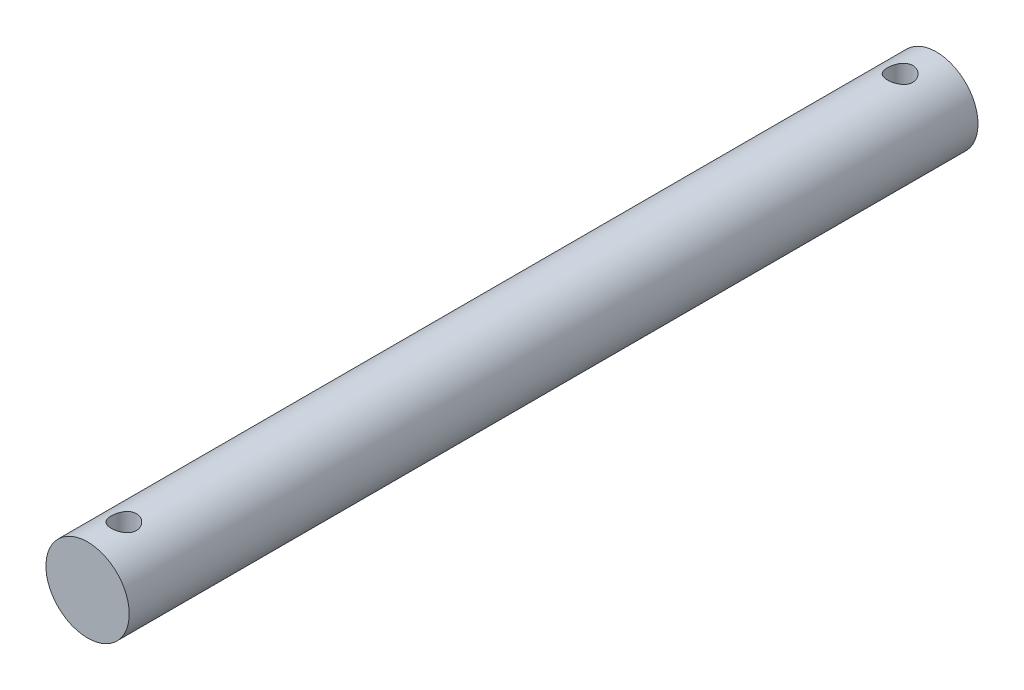
ISO-10303-21;
HEADER;
FILE_DESCRIPTION(('STEP AP214'),'2;1');
FILE_NAME('part.step','',(''),(''),'','','');
FILE_SCHEMA(('AUTOMOTIVE_DESIGN { 1 0 10303 214 1 1 1 1 }'));
ENDSEC;
DATA;
#1=APPLICATION_CONTEXT('core data for automotive mechanical design processes');
#2=APPLICATION_PROTOCOL_DEFINITION('international standard','automotive_design',2000,#1);
#3=PRODUCT_CONTEXT('',#1,'mechanical');
#4=PRODUCT('Part','Part','',(#3));
#5=PRODUCT_RELATED_PRODUCT_CATEGORY('part','',(#4));
#6=PRODUCT_DEFINITION_FORMATION('','',#4);
#7=PRODUCT_DEFINITION_CONTEXT('part definition',#1,'design');
#8=PRODUCT_DEFINITION('design','',#6,#7);
#9=PRODUCT_DEFINITION_SHAPE('','',#8);
#10=(LENGTH_UNIT() NAMED_UNIT(*) SI_UNIT(.MILLI.,.METRE.));
#11=(NAMED_UNIT(*) PLANE_ANGLE_UNIT() SI_UNIT($,.RADIAN.));
#12=(NAMED_UNIT(*) SI_UNIT($,.STERADIAN.) SOLID_ANGLE_UNIT());
#13=UNCERTAINTY_MEASURE_WITH_UNIT(LENGTH_MEASURE(1.E-05),#10,'distance_accuracy_value','');
#14=(GEOMETRIC_REPRESENTATION_CONTEXT(3) GLOBAL_UNCERTAINTY_ASSIGNED_CONTEXT((#13)) GLOBAL_UNIT_ASSIGNED_CONTEXT((#10,
#11,#12)) REPRESENTATION_CONTEXT('',''));
#15=CARTESIAN_POINT('',(0.,0.,0.));
#16=DIRECTION('',(0.,0.,1.));
#17=DIRECTION('',(1.,0.,0.));
#18=AXIS2_PLACEMENT_3D('',#15,#16,#17);
#19=CARTESIAN_POINT('',(0.,0.,117.15));
#20=DIRECTION('',(0.,0.,-1.));
#21=DIRECTION('',(-1.,0.,0.));
#22=AXIS2_PLACEMENT_3D('',#19,#20,#21);
#23=CYLINDRICAL_SURFACE('',#22,5.75);
#24=CARTESIAN_POINT('',(0.,-5.75,113.9));
#25=CARTESIAN_POINT('',(0.0959385713287594,-5.74999928777835,113.899999015544));
#26=CARTESIAN_POINT('',(0.191887129062954,-5.74757604778291,113.892084575488));
#27=CARTESIAN_POINT('',(0.380986060443953,-5.73814623317171,113.860713755079));
#28=CARTESIAN_POINT('',(0.474135661732902,-5.73113840539236,113.837253125266));
#29=CARTESIAN_POINT('',(0.654882106105356,-5.71330648621698,113.77564875893));
#30=CARTESIAN_POINT('',(0.742487052017552,-5.70248812281643,113.737527053072));
#31=CARTESIAN_POINT('',(0.910061375677811,-5.67815701256937,113.647774179451));
#32=CARTESIAN_POINT('',(0.990029669955899,-5.66464388423343,113.596141098603));
#33=CARTESIAN_POINT('',(1.14241673866345,-5.63591702088801,113.47922889998));
#34=CARTESIAN_POINT('',(1.21457883766208,-5.62066767139372,113.41362400026));
#35=CARTESIAN_POINT('',(1.3470652424525,-5.59039738107246,113.27132455424));
#36=CARTESIAN_POINT('',(1.40738748497903,-5.57537648047599,113.19462807911));
#37=CARTESIAN_POINT('',(1.51584662453451,-5.54688517999019,113.030133541635));
#38=CARTESIAN_POINT('',(1.56366770328496,-5.53345893413336,112.942118876368));
#39=CARTESIAN_POINT('',(1.64372440655954,-5.51021055853753,112.758822184792));
#40=CARTESIAN_POINT('',(1.67596389761843,-5.50038753481332,112.663541968214));
#41=CARTESIAN_POINT('',(1.72301200976909,-5.48582941838635,112.471306009556));
#42=CARTESIAN_POINT('',(1.73829484939492,-5.48095624570664,112.374477069449));
#43=CARTESIAN_POINT('',(1.75247689262192,-5.47643909454704,112.179516331369));
#44=CARTESIAN_POINT('',(1.75138019704311,-5.47679380720084,112.081384865646));
#45=CARTESIAN_POINT('',(1.73320623710372,-5.48257014127575,111.890483676235));
#46=CARTESIAN_POINT('',(1.7167260602907,-5.48780243631886,111.797650426375));
#47=CARTESIAN_POINT('',(1.66921881423739,-5.50243765779226,111.616134415106));
#48=CARTESIAN_POINT('',(1.63819027151027,-5.51184100666981,111.527452075109));
#49=CARTESIAN_POINT('',(1.56203354523887,-5.53390783991856,111.3553078955));
#50=CARTESIAN_POINT('',(1.51671383693437,-5.54661517100887,111.271936647735));
#51=CARTESIAN_POINT('',(1.41339431878934,-5.57383743640775,111.11378380161));
#52=CARTESIAN_POINT('',(1.35539135927417,-5.58835281932993,111.039004343927));
#53=CARTESIAN_POINT('',(1.22539861007512,-5.61832064885968,110.89677497668));
#54=CARTESIAN_POINT('',(1.15291420100984,-5.63378653524159,110.829779167661));
#55=CARTESIAN_POINT('',(0.997546563326113,-5.66335994077207,110.708786693874));
#56=CARTESIAN_POINT('',(0.914662642057689,-5.67746736933109,110.65479089566));
#57=CARTESIAN_POINT('',(0.740006340300693,-5.70286965528536,110.561044550897));
#58=CARTESIAN_POINT('',(0.64817529977868,-5.7141439376432,110.521397342513));
#59=CARTESIAN_POINT('',(0.458725349157116,-5.7324612780653,110.458245604803));
#60=CARTESIAN_POINT('',(0.361108111222858,-5.73950555208144,110.434736436183));
#61=CARTESIAN_POINT('',(0.166715146681215,-5.74837570451892,110.405290141466));
#62=CARTESIAN_POINT('',(0.070040803003699,-5.75038419385996,110.398737818359));
#63=CARTESIAN_POINT('',(-0.123033725381385,-5.74949370771951,110.401663383074));
#64=CARTESIAN_POINT('',(-0.219433946031256,-5.74659540842732,110.411139062127));
#65=CARTESIAN_POINT('',(-0.406884309721018,-5.73633670363618,110.445355411109));
#66=CARTESIAN_POINT('',(-0.49800682478584,-5.72908210804504,110.469734342159));
#67=CARTESIAN_POINT('',(-0.674846412315206,-5.71095352507735,110.532627823723));
#68=CARTESIAN_POINT('',(-0.760562826945011,-5.70007909823292,110.571144090647));
#69=CARTESIAN_POINT('',(-0.926402815937071,-5.67551543698637,110.662236951982));
#70=CARTESIAN_POINT('',(-1.00634690585545,-5.66176588879431,110.715123604028));
#71=CARTESIAN_POINT('',(-1.15643402748901,-5.6330284271798,110.833080866377));
#72=CARTESIAN_POINT('',(-1.22657452438565,-5.61804019507124,110.898154617639));
#73=CARTESIAN_POINT('',(-1.35778736868868,-5.58781007369419,111.041530535008));
#74=CARTESIAN_POINT('',(-1.41842172800338,-5.57257970682757,111.120236847127));
#75=CARTESIAN_POINT('',(-1.52565587348097,-5.54418273004371,111.287038377179));
#76=CARTESIAN_POINT('',(-1.57225598171088,-5.53101607277048,111.37513337959));
#77=CARTESIAN_POINT('',(-1.64978909325865,-5.50838723871704,111.557962906399));
#78=CARTESIAN_POINT('',(-1.68079118431685,-5.49890876907322,111.652665998298));
#79=CARTESIAN_POINT('',(-1.72630914605966,-5.48479130561698,111.846292589456));
#80=CARTESIAN_POINT('',(-1.74083087782624,-5.48015059135103,111.945214575311));
#81=CARTESIAN_POINT('',(-1.75256961712525,-5.47640695713794,112.139911124122));
#82=CARTESIAN_POINT('',(-1.75050214376061,-5.47707504747841,112.235638696941));
#83=CARTESIAN_POINT('',(-1.73083575800854,-5.48332122336449,112.425313396512));
#84=CARTESIAN_POINT('',(-1.71323750191932,-5.48889910143278,112.519260598326));
#85=CARTESIAN_POINT('',(-1.66347696659913,-5.5041805294775,112.701500418495));
#86=CARTESIAN_POINT('',(-1.6315093919208,-5.51382882124011,112.789851179647));
#87=CARTESIAN_POINT('',(-1.55406978053486,-5.53615241583177,112.96000582629));
#88=CARTESIAN_POINT('',(-1.50859510171481,-5.54882831079243,113.041808426924));
#89=CARTESIAN_POINT('',(-1.40344342971552,-5.57636988722287,113.199851608945));
#90=CARTESIAN_POINT('',(-1.34329929003115,-5.59129968881273,113.275770193865));
#91=CARTESIAN_POINT('',(-1.21135031194525,-5.6213612535034,113.416669024319));
#92=CARTESIAN_POINT('',(-1.13954241675892,-5.63649306859028,113.481646393311));
#93=CARTESIAN_POINT('',(-0.983676589876039,-5.6658051979512,113.600789502351));
#94=CARTESIAN_POINT('',(-0.899312674628893,-5.67994261557294,113.654566623443));
#95=CARTESIAN_POINT('',(-0.7223108279757,-5.70515014811673,113.747100222591));
#96=CARTESIAN_POINT('',(-0.629676579305499,-5.71622161936861,113.785863345656));
#97=CARTESIAN_POINT('',(-0.44827585420314,-5.73314989234598,113.844019076472));
#98=CARTESIAN_POINT('',(-0.360039802026547,-5.73941556358756,113.86495381595));
#99=CARTESIAN_POINT('',(-0.181205185597138,-5.74784058684039,113.89294350244));
#100=CARTESIAN_POINT('',(-0.0906070464543938,-5.75000067264187,113.900000929748));
#101=CARTESIAN_POINT('',(0.,-5.75,113.9));
#102=B_SPLINE_CURVE_WITH_KNOTS('',3,(#24,#25,#26,#27,#28,#29,#30,#31,#32,#33,#34,#35,#36,#37,
#38,#39,#40,#41,#42,#43,#44,#45,#46,#47,#48,#49,#50,#51,#52,#53,#54,#55,#56,#57,#58,#59,#60,#61,
#62,#63,#64,#65,#66,#67,#68,#69,#70,#71,#72,#73,#74,#75,#76,#77,#78,#79,#80,#81,#82,#83,#84,#85,
#86,#87,#88,#89,#90,#91,#92,#93,#94,#95,#96,#97,#98,#99,#100,#101),.UNSPECIFIED.,.T.,.F.,(4,2,2,
2,2,2,2,2,2,2,2,2,2,2,2,2,2,2,2,2,2,2,2,2,2,2,2,2,2,2,2,2,2,2,2,2,2,2,4),(0.,0.287482817599106,
0.575044249378853,0.862175250836252,1.14934692942179,1.44413974938822,1.73898389572087,
2.04068122222846,2.34230364475788,2.63525967032535,2.92814235194373,3.21010987256567,
3.49210595757811,3.77805449327284,4.06407412034252,4.3624063635186,4.66075848739856,
4.96121847505486,5.26159205153441,5.55090461998096,5.84017732240673,6.12269302127628,
6.40524303166018,6.69445397412987,6.98373955723926,7.28385916157827,7.58397187805472,
7.88274334860935,8.18140853062111,8.4672633499371,8.75310609020819,9.03518724951489,
9.31732362284115,9.61000113895155,9.90275548280157,10.2044074952203,10.5059258472411,
10.7774811295992,11.0489878723855),.UNSPECIFIED.);
#103=CARTESIAN_POINT('',(0.,-5.75,113.9));
#104=VERTEX_POINT('',#103);
#105=EDGE_CURVE('E41',#104,#104,#102,.T.);
#106=ORIENTED_EDGE('',*,*,#105,.T.);
#107=EDGE_LOOP('',(#106));
#108=FACE_BOUND('',#107,.T.);
#109=CARTESIAN_POINT('',(0.,5.75,113.9));
#110=CARTESIAN_POINT('',(-0.0959385713287594,5.74999928777835,113.899999015544));
#111=CARTESIAN_POINT('',(-0.191887129062954,5.74757604778291,113.892084575488));
#112=CARTESIAN_POINT('',(-0.380986060443953,5.73814623317171,113.860713755079));
#113=CARTESIAN_POINT('',(-0.474135661732902,5.73113840539236,113.837253125266));
#114=CARTESIAN_POINT('',(-0.654882106105356,5.71330648621698,113.77564875893));
#115=CARTESIAN_POINT('',(-0.742487052017552,5.70248812281643,113.737527053072));
#116=CARTESIAN_POINT('',(-0.910061375677811,5.67815701256937,113.647774179451));
#117=CARTESIAN_POINT('',(-0.990029669955899,5.66464388423343,113.596141098603));
#118=CARTESIAN_POINT('',(-1.14241673866345,5.63591702088801,113.47922889998));
#119=CARTESIAN_POINT('',(-1.21457883766208,5.62066767139372,113.41362400026));
#120=CARTESIAN_POINT('',(-1.3470652424525,5.59039738107246,113.27132455424));
#121=CARTESIAN_POINT('',(-1.40738748497903,5.57537648047599,113.19462807911));
#122=CARTESIAN_POINT('',(-1.51584662453451,5.54688517999019,113.030133541635));
#123=CARTESIAN_POINT('',(-1.56366770328496,5.53345893413336,112.942118876368));
#124=CARTESIAN_POINT('',(-1.64372440655954,5.51021055853753,112.758822184792));
#125=CARTESIAN_POINT('',(-1.67596389761843,5.50038753481332,112.663541968214));
#126=CARTESIAN_POINT('',(-1.72301200976909,5.48582941838635,112.471306009556));
#127=CARTESIAN_POINT('',(-1.73829484939492,5.48095624570664,112.374477069449));
#128=CARTESIAN_POINT('',(-1.75247689262192,5.47643909454704,112.179516331369));
#129=CARTESIAN_POINT('',(-1.75138019704311,5.47679380720084,112.081384865646));
#130=CARTESIAN_POINT('',(-1.73320623710372,5.48257014127575,111.890483676235));
#131=CARTESIAN_POINT('',(-1.7167260602907,5.48780243631886,111.797650426375));
#132=CARTESIAN_POINT('',(-1.66921881423739,5.50243765779226,111.616134415106));
#133=CARTESIAN_POINT('',(-1.63819027151027,5.51184100666981,111.527452075109));
#134=CARTESIAN_POINT('',(-1.56203354523887,5.53390783991856,111.3553078955));
#135=CARTESIAN_POINT('',(-1.51671383693437,5.54661517100887,111.271936647735));
#136=CARTESIAN_POINT('',(-1.41339431878934,5.57383743640775,111.11378380161));
#137=CARTESIAN_POINT('',(-1.35539135927417,5.58835281932993,111.039004343927));
#138=CARTESIAN_POINT('',(-1.22539861007512,5.61832064885968,110.89677497668));
#139=CARTESIAN_POINT('',(-1.15291420100984,5.63378653524159,110.829779167661));
#140=CARTESIAN_POINT('',(-0.997546563326113,5.66335994077207,110.708786693874));
#141=CARTESIAN_POINT('',(-0.914662642057689,5.67746736933109,110.65479089566));
#142=CARTESIAN_POINT('',(-0.740006340300693,5.70286965528536,110.561044550897));
#143=CARTESIAN_POINT('',(-0.64817529977868,5.7141439376432,110.521397342513));
#144=CARTESIAN_POINT('',(-0.458725349157116,5.7324612780653,110.458245604803));
#145=CARTESIAN_POINT('',(-0.361108111222858,5.73950555208144,110.434736436183));
#146=CARTESIAN_POINT('',(-0.166715146681215,5.74837570451892,110.405290141466));
#147=CARTESIAN_POINT('',(-0.070040803003699,5.75038419385996,110.398737818359));
#148=CARTESIAN_POINT('',(0.123033725381385,5.74949370771951,110.401663383074));
#149=CARTESIAN_POINT('',(0.219433946031256,5.74659540842732,110.411139062127));
#150=CARTESIAN_POINT('',(0.406884309721018,5.73633670363618,110.445355411109));
#151=CARTESIAN_POINT('',(0.49800682478584,5.72908210804504,110.469734342159));
#152=CARTESIAN_POINT('',(0.674846412315206,5.71095352507735,110.532627823723));
#153=CARTESIAN_POINT('',(0.760562826945011,5.70007909823292,110.571144090647));
#154=CARTESIAN_POINT('',(0.926402815937071,5.67551543698637,110.662236951982));
#155=CARTESIAN_POINT('',(1.00634690585545,5.66176588879431,110.715123604028));
#156=CARTESIAN_POINT('',(1.15643402748901,5.6330284271798,110.833080866377));
#157=CARTESIAN_POINT('',(1.22657452438565,5.61804019507124,110.898154617639));
#158=CARTESIAN_POINT('',(1.35778736868868,5.58781007369419,111.041530535008));
#159=CARTESIAN_POINT('',(1.41842172800338,5.57257970682757,111.120236847127));
#160=CARTESIAN_POINT('',(1.52565587348097,5.54418273004371,111.287038377179));
#161=CARTESIAN_POINT('',(1.57225598171088,5.53101607277048,111.37513337959));
#162=CARTESIAN_POINT('',(1.64978909325865,5.50838723871704,111.557962906399));
#163=CARTESIAN_POINT('',(1.68079118431685,5.49890876907322,111.652665998298));
#164=CARTESIAN_POINT('',(1.72630914605966,5.48479130561698,111.846292589456));
#165=CARTESIAN_POINT('',(1.74083087782624,5.48015059135103,111.945214575311));
#166=CARTESIAN_POINT('',(1.75256961712525,5.47640695713794,112.139911124122));
#167=CARTESIAN_POINT('',(1.75050214376061,5.47707504747841,112.235638696941));
#168=CARTESIAN_POINT('',(1.73083575800854,5.48332122336449,112.425313396512));
#169=CARTESIAN_POINT('',(1.71323750191932,5.48889910143278,112.519260598326));
#170=CARTESIAN_POINT('',(1.66347696659913,5.5041805294775,112.701500418495));
#171=CARTESIAN_POINT('',(1.6315093919208,5.51382882124011,112.789851179647));
#172=CARTESIAN_POINT('',(1.55406978053486,5.53615241583177,112.96000582629));
#173=CARTESIAN_POINT('',(1.50859510171481,5.54882831079243,113.041808426924));
#174=CARTESIAN_POINT('',(1.40344342971552,5.57636988722287,113.199851608945));
#175=CARTESIAN_POINT('',(1.34329929003115,5.59129968881273,113.275770193865));
#176=CARTESIAN_POINT('',(1.21135031194525,5.6213612535034,113.416669024319));
#177=CARTESIAN_POINT('',(1.13954241675892,5.63649306859028,113.481646393311));
#178=CARTESIAN_POINT('',(0.983676589876039,5.6658051979512,113.600789502351));
#179=CARTESIAN_POINT('',(0.899312674628893,5.67994261557294,113.654566623443));
#180=CARTESIAN_POINT('',(0.7223108279757,5.70515014811673,113.747100222591));
#181=CARTESIAN_POINT('',(0.629676579305499,5.71622161936861,113.785863345656));
#182=CARTESIAN_POINT('',(0.44827585420314,5.73314989234598,113.844019076472));
#183=CARTESIAN_POINT('',(0.360039802026547,5.73941556358756,113.86495381595));
#184=CARTESIAN_POINT('',(0.181205185597138,5.74784058684039,113.89294350244));
#185=CARTESIAN_POINT('',(0.0906070464543938,5.75000067264187,113.900000929748));
#186=CARTESIAN_POINT('',(0.,5.75,113.9));
#187=B_SPLINE_CURVE_WITH_KNOTS('',3,(#109,#110,#111,#112,#113,#114,#115,#116,#117,#118,#119,
#120,#121,#122,#123,#124,#125,#126,#127,#128,#129,#130,#131,#132,#133,#134,#135,#136,#137,#138,
#139,#140,#141,#142,#143,#144,#145,#146,#147,#148,#149,#150,#151,#152,#153,#154,#155,#156,#157,
#158,#159,#160,#161,#162,#163,#164,#165,#166,#167,#168,#169,#170,#171,#172,#173,#174,#175,#176,
#177,#178,#179,#180,#181,#182,#183,#184,#185,#186),.UNSPECIFIED.,.T.,.F.,(4,2,2,2,2,2,2,2,2,2,2,
2,2,2,2,2,2,2,2,2,2,2,2,2,2,2,2,2,2,2,2,2,2,2,2,2,2,2,4),(0.,0.287482817599106,
0.575044249378853,0.862175250836252,1.14934692942179,1.44413974938822,1.73898389572087,
2.04068122222846,2.34230364475788,2.63525967032535,2.92814235194373,3.21010987256567,
3.49210595757811,3.77805449327284,4.06407412034252,4.3624063635186,4.66075848739856,
4.96121847505486,5.26159205153441,5.55090461998096,5.84017732240673,6.12269302127628,
6.40524303166018,6.69445397412987,6.98373955723926,7.28385916157827,7.58397187805472,
7.88274334860935,8.18140853062111,8.4672633499371,8.75310609020819,9.03518724951489,
9.31732362284115,9.61000113895155,9.90275548280157,10.2044074952203,10.5059258472411,
10.7774811295992,11.0489878723855),.UNSPECIFIED.);
#188=CARTESIAN_POINT('',(0.,5.75,113.9));
#189=VERTEX_POINT('',#188);
#190=EDGE_CURVE('E96',#189,#189,#187,.T.);
#191=ORIENTED_EDGE('',*,*,#190,.T.);
#192=EDGE_LOOP('',(#191));
#193=FACE_BOUND('',#192,.T.);
#194=CARTESIAN_POINT('',(0.,0.,117.15));
#195=DIRECTION('',(0.,0.,1.));
#196=DIRECTION('',(1.,0.,0.));
#197=AXIS2_PLACEMENT_3D('',#194,#195,#196);
#198=CIRCLE('',#197,5.75);
#199=CARTESIAN_POINT('',(5.75,0.,117.15));
#200=VERTEX_POINT('',#199);
#201=EDGE_CURVE('E10',#200,#200,#198,.T.);
#202=ORIENTED_EDGE('',*,*,#201,.F.);
#203=EDGE_LOOP('',(#202));
#204=FACE_BOUND('',#203,.T.);
#205=CARTESIAN_POINT('',(0.,0.,0.));
#206=DIRECTION('',(0.,0.,1.));
#207=DIRECTION('',(1.,0.,0.));
#208=AXIS2_PLACEMENT_3D('',#205,#206,#207);
#209=CIRCLE('',#208,5.75);
#210=CARTESIAN_POINT('',(5.75,0.,0.));
#211=VERTEX_POINT('',#210);
#212=EDGE_CURVE('E50',#211,#211,#209,.T.);
#213=ORIENTED_EDGE('',*,*,#212,.T.);
#214=EDGE_LOOP('',(#213));
#215=FACE_BOUND('',#214,.T.);
#216=CARTESIAN_POINT('',(0.,-5.75,3.25));
#217=CARTESIAN_POINT('',(0.0959385713287591,-5.74999928777835,3.25000098445609));
#218=CARTESIAN_POINT('',(0.191887129062953,-5.74757604778291,3.25791542451199));
#219=CARTESIAN_POINT('',(0.380986060443951,-5.73814623317171,3.28928624492064));
#220=CARTESIAN_POINT('',(0.4741356617329,-5.73113840539236,3.3127468747335));
#221=CARTESIAN_POINT('',(0.654882106105352,-5.71330648621698,3.37435124106983));
#222=CARTESIAN_POINT('',(0.742487052017546,-5.70248812281644,3.41247294692825));
#223=CARTESIAN_POINT('',(0.910061375677803,-5.67815701256937,3.50222582054881));
#224=CARTESIAN_POINT('',(0.99002966995589,-5.66464388423343,3.55385890139742));
#225=CARTESIAN_POINT('',(1.14241673866344,-5.63591702088801,3.67077110002036));
#226=CARTESIAN_POINT('',(1.21457883766207,-5.62066767139372,3.7363759997399));
#227=CARTESIAN_POINT('',(1.34706524245249,-5.59039738107246,3.8786754457603));
#228=CARTESIAN_POINT('',(1.40738748497902,-5.57537648047599,3.95537192089033));
#229=CARTESIAN_POINT('',(1.5158466245345,-5.54688517999019,4.11986645836505));
#230=CARTESIAN_POINT('',(1.56366770328496,-5.53345893413336,4.20788112363194));
#231=CARTESIAN_POINT('',(1.64372440655953,-5.51021055853754,4.39117781520815));
#232=CARTESIAN_POINT('',(1.67596389761842,-5.50038753481332,4.48645803178633));
#233=CARTESIAN_POINT('',(1.72301200976908,-5.48582941838635,4.67869399044358));
#234=CARTESIAN_POINT('',(1.73829484939491,-5.48095624570665,4.77552293055072));
#235=CARTESIAN_POINT('',(1.75247689262191,-5.47643909454705,4.97048366863124));
#236=CARTESIAN_POINT('',(1.7513801970431,-5.47679380720085,5.06861513435426));
#237=CARTESIAN_POINT('',(1.73320623710371,-5.48257014127575,5.25951632376466));
#238=CARTESIAN_POINT('',(1.71672606029069,-5.48780243631886,5.35234957362478));
#239=CARTESIAN_POINT('',(1.66921881423738,-5.50243765779226,5.53386558489435));
#240=CARTESIAN_POINT('',(1.63819027151026,-5.51184100666981,5.62254792489071));
#241=CARTESIAN_POINT('',(1.56203354523885,-5.53390783991856,5.79469210450024));
#242=CARTESIAN_POINT('',(1.51671383693436,-5.54661517100887,5.87806335226514));
#243=CARTESIAN_POINT('',(1.41339431878933,-5.57383743640775,6.0362161983899));
#244=CARTESIAN_POINT('',(1.35539135927416,-5.58835281932994,6.1109956560725));
#245=CARTESIAN_POINT('',(1.22539861007511,-5.61832064885968,6.25322502332016));
#246=CARTESIAN_POINT('',(1.15291420100984,-5.63378653524159,6.32022083233922));
#247=CARTESIAN_POINT('',(0.997546563326113,-5.66335994077207,6.4412133061259));
#248=CARTESIAN_POINT('',(0.914662642057686,-5.67746736933109,6.49520910433986));
#249=CARTESIAN_POINT('',(0.740006340300687,-5.70286965528536,6.58895544910279));
#250=CARTESIAN_POINT('',(0.648175299778673,-5.7141439376432,6.62860265748745));
#251=CARTESIAN_POINT('',(0.458725349157109,-5.7324612780653,6.69175439519696));
#252=CARTESIAN_POINT('',(0.361108111222851,-5.73950555208144,6.71526356381708));
#253=CARTESIAN_POINT('',(0.166715146681207,-5.74837570451892,6.74470985853363));
#254=CARTESIAN_POINT('',(0.070040803003693,-5.75038419385996,6.75126218164074));
#255=CARTESIAN_POINT('',(-0.12303372538139,-5.74949370771951,6.74833661692566));
#256=CARTESIAN_POINT('',(-0.21943394603126,-5.74659540842732,6.73886093787281));
#257=CARTESIAN_POINT('',(-0.406884309721018,-5.73633670363618,6.70464458889131));
#258=CARTESIAN_POINT('',(-0.498006824785836,-5.72908210804503,6.68026565784105));
#259=CARTESIAN_POINT('',(-0.6748464123152,-5.71095352507735,6.61737217627732));
#260=CARTESIAN_POINT('',(-0.760562826945007,-5.70007909823292,6.57885590935332));
#261=CARTESIAN_POINT('',(-0.926402815937066,-5.67551543698637,6.48776304801783));
#262=CARTESIAN_POINT('',(-1.00634690585544,-5.66176588879431,6.43487639597208));
#263=CARTESIAN_POINT('',(-1.156434027489,-5.6330284271798,6.31691913362321));
#264=CARTESIAN_POINT('',(-1.22657452438564,-5.61804019507124,6.25184538236129));
#265=CARTESIAN_POINT('',(-1.35778736868868,-5.58781007369419,6.10846946499204));
#266=CARTESIAN_POINT('',(-1.41842172800337,-5.57257970682757,6.02976315287282));
#267=CARTESIAN_POINT('',(-1.52565587348096,-5.54418273004371,5.86296162282136));
#268=CARTESIAN_POINT('',(-1.57225598171087,-5.53101607277048,5.77486662040964));
#269=CARTESIAN_POINT('',(-1.64978909325864,-5.50838723871704,5.59203709360121));
#270=CARTESIAN_POINT('',(-1.68079118431684,-5.49890876907322,5.49733400170234));
#271=CARTESIAN_POINT('',(-1.72630914605965,-5.48479130561698,5.30370741054431));
#272=CARTESIAN_POINT('',(-1.74083087782623,-5.48015059135103,5.20478542468901));
#273=CARTESIAN_POINT('',(-1.75256961712523,-5.47640695713795,5.0100888758783));
#274=CARTESIAN_POINT('',(-1.7505021437606,-5.47707504747841,4.91436130305891));
#275=CARTESIAN_POINT('',(-1.73083575800853,-5.4833212233645,4.72468660348847));
#276=CARTESIAN_POINT('',(-1.71323750191931,-5.48889910143278,4.63073940167405));
#277=CARTESIAN_POINT('',(-1.66347696659913,-5.5041805294775,4.44849958150498));
#278=CARTESIAN_POINT('',(-1.6315093919208,-5.51382882124011,4.36014882035343));
#279=CARTESIAN_POINT('',(-1.55406978053486,-5.53615241583177,4.18999417370982));
#280=CARTESIAN_POINT('',(-1.5085951017148,-5.54882831079243,4.10819157307554));
#281=CARTESIAN_POINT('',(-1.40344342971551,-5.57636988722287,3.95014839105541));
#282=CARTESIAN_POINT('',(-1.34329929003114,-5.59129968881273,3.87422980613475));
#283=CARTESIAN_POINT('',(-1.21135031194524,-5.6213612535034,3.73333097568074));
#284=CARTESIAN_POINT('',(-1.13954241675891,-5.63649306859029,3.66835360668869));
#285=CARTESIAN_POINT('',(-0.983676589876031,-5.6658051979512,3.54921049764876));
#286=CARTESIAN_POINT('',(-0.899312674628887,-5.67994261557294,3.49543337655733));
#287=CARTESIAN_POINT('',(-0.722310827975696,-5.70515014811673,3.40289977740904));
#288=CARTESIAN_POINT('',(-0.629676579305494,-5.71622161936861,3.36413665434357));
#289=CARTESIAN_POINT('',(-0.448275854203135,-5.73314989234598,3.30598092352814));
#290=CARTESIAN_POINT('',(-0.360039802026543,-5.73941556358756,3.28504618404956));
#291=CARTESIAN_POINT('',(-0.181205185597135,-5.74784058684039,3.2570564975598));
#292=CARTESIAN_POINT('',(-0.0906070464543924,-5.75000067264187,3.24999907025237));
#293=CARTESIAN_POINT('',(0.,-5.75,3.25));
#294=B_SPLINE_CURVE_WITH_KNOTS('',3,(#216,#217,#218,#219,#220,#221,#222,#223,#224,#225,#226,
#227,#228,#229,#230,#231,#232,#233,#234,#235,#236,#237,#238,#239,#240,#241,#242,#243,#244,#245,
#246,#247,#248,#249,#250,#251,#252,#253,#254,#255,#256,#257,#258,#259,#260,#261,#262,#263,#264,
#265,#266,#267,#268,#269,#270,#271,#272,#273,#274,#275,#276,#277,#278,#279,#280,#281,#282,#283,
#284,#285,#286,#287,#288,#289,#290,#291,#292,#293),.UNSPECIFIED.,.T.,.F.,(4,2,2,2,2,2,2,2,2,2,2,
2,2,2,2,2,2,2,2,2,2,2,2,2,2,2,2,2,2,2,2,2,2,2,2,2,2,2,4),(0.,0.287482817599105,0.57504424937885,
0.862175250836247,1.14934692942177,1.4441397493882,1.73898389572086,2.04068122222845,
2.34230364475786,2.63525967032531,2.92814235194371,3.21010987256565,3.49210595757809,
3.77805449327281,4.06407412034249,4.36240636351856,4.66075848739852,4.96121847505483,
5.26159205153438,5.55090461998093,5.8401773224067,6.12269302127624,6.40524303166014,
6.69445397412982,6.98373955723922,7.28385916157821,7.58397187805467,7.8827433486093,
8.18140853062105,8.46726334993702,8.75310609020813,9.03518724951482,9.31732362284109,
9.61000113895148,9.9027554828015,10.2044074952202,10.505925847241,10.7774811295992,
11.0489878723855),.UNSPECIFIED.);
#295=CARTESIAN_POINT('',(0.,-5.75,3.25));
#296=VERTEX_POINT('',#295);
#297=EDGE_CURVE('E59',#296,#296,#294,.T.);
#298=ORIENTED_EDGE('',*,*,#297,.F.);
#299=EDGE_LOOP('',(#298));
#300=FACE_BOUND('',#299,.T.);
#301=CARTESIAN_POINT('',(0.,5.75,3.25));
#302=CARTESIAN_POINT('',(-0.0959385713287591,5.74999928777835,3.25000098445609));
#303=CARTESIAN_POINT('',(-0.191887129062953,5.74757604778291,3.25791542451199));
#304=CARTESIAN_POINT('',(-0.380986060443951,5.73814623317171,3.28928624492064));
#305=CARTESIAN_POINT('',(-0.4741356617329,5.73113840539236,3.3127468747335));
#306=CARTESIAN_POINT('',(-0.654882106105352,5.71330648621698,3.37435124106983));
#307=CARTESIAN_POINT('',(-0.742487052017546,5.70248812281644,3.41247294692825));
#308=CARTESIAN_POINT('',(-0.910061375677803,5.67815701256937,3.50222582054881));
#309=CARTESIAN_POINT('',(-0.99002966995589,5.66464388423343,3.55385890139742));
#310=CARTESIAN_POINT('',(-1.14241673866344,5.63591702088801,3.67077110002036));
#311=CARTESIAN_POINT('',(-1.21457883766207,5.62066767139372,3.7363759997399));
#312=CARTESIAN_POINT('',(-1.34706524245249,5.59039738107246,3.8786754457603));
#313=CARTESIAN_POINT('',(-1.40738748497902,5.57537648047599,3.95537192089033));
#314=CARTESIAN_POINT('',(-1.5158466245345,5.54688517999019,4.11986645836505));
#315=CARTESIAN_POINT('',(-1.56366770328496,5.53345893413336,4.20788112363194));
#316=CARTESIAN_POINT('',(-1.64372440655953,5.51021055853754,4.39117781520815));
#317=CARTESIAN_POINT('',(-1.67596389761842,5.50038753481332,4.48645803178633));
#318=CARTESIAN_POINT('',(-1.72301200976908,5.48582941838635,4.67869399044358));
#319=CARTESIAN_POINT('',(-1.73829484939491,5.48095624570665,4.77552293055072));
#320=CARTESIAN_POINT('',(-1.75247689262191,5.47643909454705,4.97048366863124));
#321=CARTESIAN_POINT('',(-1.7513801970431,5.47679380720085,5.06861513435426));
#322=CARTESIAN_POINT('',(-1.73320623710371,5.48257014127575,5.25951632376466));
#323=CARTESIAN_POINT('',(-1.71672606029069,5.48780243631886,5.35234957362478));
#324=CARTESIAN_POINT('',(-1.66921881423738,5.50243765779226,5.53386558489435));
#325=CARTESIAN_POINT('',(-1.63819027151026,5.51184100666981,5.62254792489071));
#326=CARTESIAN_POINT('',(-1.56203354523885,5.53390783991856,5.79469210450024));
#327=CARTESIAN_POINT('',(-1.51671383693436,5.54661517100887,5.87806335226514));
#328=CARTESIAN_POINT('',(-1.41339431878933,5.57383743640775,6.0362161983899));
#329=CARTESIAN_POINT('',(-1.35539135927416,5.58835281932994,6.1109956560725));
#330=CARTESIAN_POINT('',(-1.22539861007511,5.61832064885968,6.25322502332016));
#331=CARTESIAN_POINT('',(-1.15291420100984,5.63378653524159,6.32022083233922));
#332=CARTESIAN_POINT('',(-0.997546563326113,5.66335994077207,6.4412133061259));
#333=CARTESIAN_POINT('',(-0.914662642057686,5.67746736933109,6.49520910433986));
#334=CARTESIAN_POINT('',(-0.740006340300687,5.70286965528536,6.58895544910279));
#335=CARTESIAN_POINT('',(-0.648175299778673,5.7141439376432,6.62860265748745));
#336=CARTESIAN_POINT('',(-0.458725349157109,5.7324612780653,6.69175439519696));
#337=CARTESIAN_POINT('',(-0.361108111222851,5.73950555208144,6.71526356381708));
#338=CARTESIAN_POINT('',(-0.166715146681207,5.74837570451892,6.74470985853363));
#339=CARTESIAN_POINT('',(-0.070040803003693,5.75038419385996,6.75126218164074));
#340=CARTESIAN_POINT('',(0.12303372538139,5.74949370771951,6.74833661692566));
#341=CARTESIAN_POINT('',(0.21943394603126,5.74659540842732,6.73886093787281));
#342=CARTESIAN_POINT('',(0.406884309721018,5.73633670363618,6.70464458889131));
#343=CARTESIAN_POINT('',(0.498006824785836,5.72908210804503,6.68026565784105));
#344=CARTESIAN_POINT('',(0.6748464123152,5.71095352507735,6.61737217627732));
#345=CARTESIAN_POINT('',(0.760562826945007,5.70007909823292,6.57885590935332));
#346=CARTESIAN_POINT('',(0.926402815937066,5.67551543698637,6.48776304801783));
#347=CARTESIAN_POINT('',(1.00634690585544,5.66176588879431,6.43487639597208));
#348=CARTESIAN_POINT('',(1.156434027489,5.6330284271798,6.31691913362321));
#349=CARTESIAN_POINT('',(1.22657452438564,5.61804019507124,6.25184538236129));
#350=CARTESIAN_POINT('',(1.35778736868868,5.58781007369419,6.10846946499204));
#351=CARTESIAN_POINT('',(1.41842172800337,5.57257970682757,6.02976315287282));
#352=CARTESIAN_POINT('',(1.52565587348096,5.54418273004371,5.86296162282136));
#353=CARTESIAN_POINT('',(1.57225598171087,5.53101607277048,5.77486662040964));
#354=CARTESIAN_POINT('',(1.64978909325864,5.50838723871704,5.59203709360121));
#355=CARTESIAN_POINT('',(1.68079118431684,5.49890876907322,5.49733400170234));
#356=CARTESIAN_POINT('',(1.72630914605965,5.48479130561698,5.30370741054431));
#357=CARTESIAN_POINT('',(1.74083087782623,5.48015059135103,5.20478542468901));
#358=CARTESIAN_POINT('',(1.75256961712523,5.47640695713795,5.0100888758783));
#359=CARTESIAN_POINT('',(1.7505021437606,5.47707504747841,4.91436130305891));
#360=CARTESIAN_POINT('',(1.73083575800853,5.4833212233645,4.72468660348847));
#361=CARTESIAN_POINT('',(1.71323750191931,5.48889910143278,4.63073940167405));
#362=CARTESIAN_POINT('',(1.66347696659913,5.5041805294775,4.44849958150498));
#363=CARTESIAN_POINT('',(1.6315093919208,5.51382882124011,4.36014882035343));
#364=CARTESIAN_POINT('',(1.55406978053486,5.53615241583177,4.18999417370982));
#365=CARTESIAN_POINT('',(1.5085951017148,5.54882831079243,4.10819157307554));
#366=CARTESIAN_POINT('',(1.40344342971551,5.57636988722287,3.95014839105541));
#367=CARTESIAN_POINT('',(1.34329929003114,5.59129968881273,3.87422980613475));
#368=CARTESIAN_POINT('',(1.21135031194524,5.6213612535034,3.73333097568074));
#369=CARTESIAN_POINT('',(1.13954241675891,5.63649306859029,3.66835360668869));
#370=CARTESIAN_POINT('',(0.983676589876031,5.6658051979512,3.54921049764876));
#371=CARTESIAN_POINT('',(0.899312674628887,5.67994261557294,3.49543337655733));
#372=CARTESIAN_POINT('',(0.722310827975696,5.70515014811673,3.40289977740904));
#373=CARTESIAN_POINT('',(0.629676579305494,5.71622161936861,3.36413665434357));
#374=CARTESIAN_POINT('',(0.448275854203135,5.73314989234598,3.30598092352814));
#375=CARTESIAN_POINT('',(0.360039802026543,5.73941556358756,3.28504618404956));
#376=CARTESIAN_POINT('',(0.181205185597135,5.74784058684039,3.2570564975598));
#377=CARTESIAN_POINT('',(0.0906070464543924,5.75000067264187,3.24999907025237));
#378=CARTESIAN_POINT('',(0.,5.75,3.25));
#379=B_SPLINE_CURVE_WITH_KNOTS('',3,(#301,#302,#303,#304,#305,#306,#307,#308,#309,#310,#311,
#312,#313,#314,#315,#316,#317,#318,#319,#320,#321,#322,#323,#324,#325,#326,#327,#328,#329,#330,
#331,#332,#333,#334,#335,#336,#337,#338,#339,#340,#341,#342,#343,#344,#345,#346,#347,#348,#349,
#350,#351,#352,#353,#354,#355,#356,#357,#358,#359,#360,#361,#362,#363,#364,#365,#366,#367,#368,
#369,#370,#371,#372,#373,#374,#375,#376,#377,#378),.UNSPECIFIED.,.T.,.F.,(4,2,2,2,2,2,2,2,2,2,2,
2,2,2,2,2,2,2,2,2,2,2,2,2,2,2,2,2,2,2,2,2,2,2,2,2,2,2,4),(0.,0.287482817599105,0.57504424937885,
0.862175250836247,1.14934692942177,1.4441397493882,1.73898389572086,2.04068122222845,
2.34230364475786,2.63525967032531,2.92814235194371,3.21010987256565,3.49210595757809,
3.77805449327281,4.06407412034249,4.36240636351856,4.66075848739852,4.96121847505483,
5.26159205153438,5.55090461998093,5.8401773224067,6.12269302127624,6.40524303166014,
6.69445397412982,6.98373955723922,7.28385916157821,7.58397187805467,7.8827433486093,
8.18140853062105,8.46726334993702,8.75310609020813,9.03518724951482,9.31732362284109,
9.61000113895148,9.9027554828015,10.2044074952202,10.505925847241,10.7774811295992,
11.0489878723855),.UNSPECIFIED.);
#380=CARTESIAN_POINT('',(0.,5.75,3.25));
#381=VERTEX_POINT('',#380);
#382=EDGE_CURVE('E56',#381,#381,#379,.T.);
#383=ORIENTED_EDGE('',*,*,#382,.F.);
#384=EDGE_LOOP('',(#383));
#385=FACE_BOUND('',#384,.T.);
#386=ADVANCED_FACE('F37',(#108,#193,#204,#215,#300,#385),#23,.T.);
#387=CARTESIAN_POINT('',(0.,0.,117.15));
#388=DIRECTION('',(0.,0.,1.));
#389=DIRECTION('',(1.,0.,0.));
#390=AXIS2_PLACEMENT_3D('',#387,#388,#389);
#391=PLANE('',#390);
#392=ORIENTED_EDGE('',*,*,#201,.T.);
#393=EDGE_LOOP('',(#392));
#394=FACE_BOUND('',#393,.T.);
#395=ADVANCED_FACE('F78',(#394),#391,.T.);
#396=CARTESIAN_POINT('',(0.,0.,0.));
#397=DIRECTION('',(0.,0.,1.));
#398=DIRECTION('',(1.,0.,0.));
#399=AXIS2_PLACEMENT_3D('',#396,#397,#398);
#400=PLANE('',#399);
#401=ORIENTED_EDGE('',*,*,#212,.F.);
#402=EDGE_LOOP('',(#401));
#403=FACE_BOUND('',#402,.T.);
#404=ADVANCED_FACE('F75',(#403),#400,.F.);
#405=CARTESIAN_POINT('',(0.,15.,5.));
#406=DIRECTION('',(0.,-1.,0.));
#407=DIRECTION('',(0.,0.,-1.));
#408=AXIS2_PLACEMENT_3D('',#405,#406,#407);
#409=CYLINDRICAL_SURFACE('',#408,1.75);
#410=ORIENTED_EDGE('',*,*,#297,.T.);
#411=EDGE_LOOP('',(#410));
#412=FACE_BOUND('',#411,.T.);
#413=ORIENTED_EDGE('',*,*,#382,.T.);
#414=EDGE_LOOP('',(#413));
#415=FACE_BOUND('',#414,.T.);
#416=ADVANCED_FACE('F70',(#412,#415),#409,.F.);
#417=CARTESIAN_POINT('',(0.,-13.,112.15));
#418=DIRECTION('',(0.,1.,0.));
#419=DIRECTION('',(0.,0.,1.));
#420=AXIS2_PLACEMENT_3D('',#417,#418,#419);
#421=CYLINDRICAL_SURFACE('',#420,1.75000000000001);
#422=ORIENTED_EDGE('',*,*,#190,.F.);
#423=EDGE_LOOP('',(#422));
#424=FACE_BOUND('',#423,.T.);
#425=ORIENTED_EDGE('',*,*,#105,.F.);
#426=EDGE_LOOP('',(#425));
#427=FACE_BOUND('',#426,.T.);
#428=ADVANCED_FACE('F74',(#424,#427),#421,.F.);
#429=CLOSED_SHELL('',(#386,#395,#404,#416,#428));
#430=MANIFOLD_SOLID_BREP('B2',#429);
#431=ADVANCED_BREP_SHAPE_REPRESENTATION('',(#18,#430),#14);
#432=SHAPE_DEFINITION_REPRESENTATION(#9,#431);
ENDSEC;
END-ISO-10303-21;
